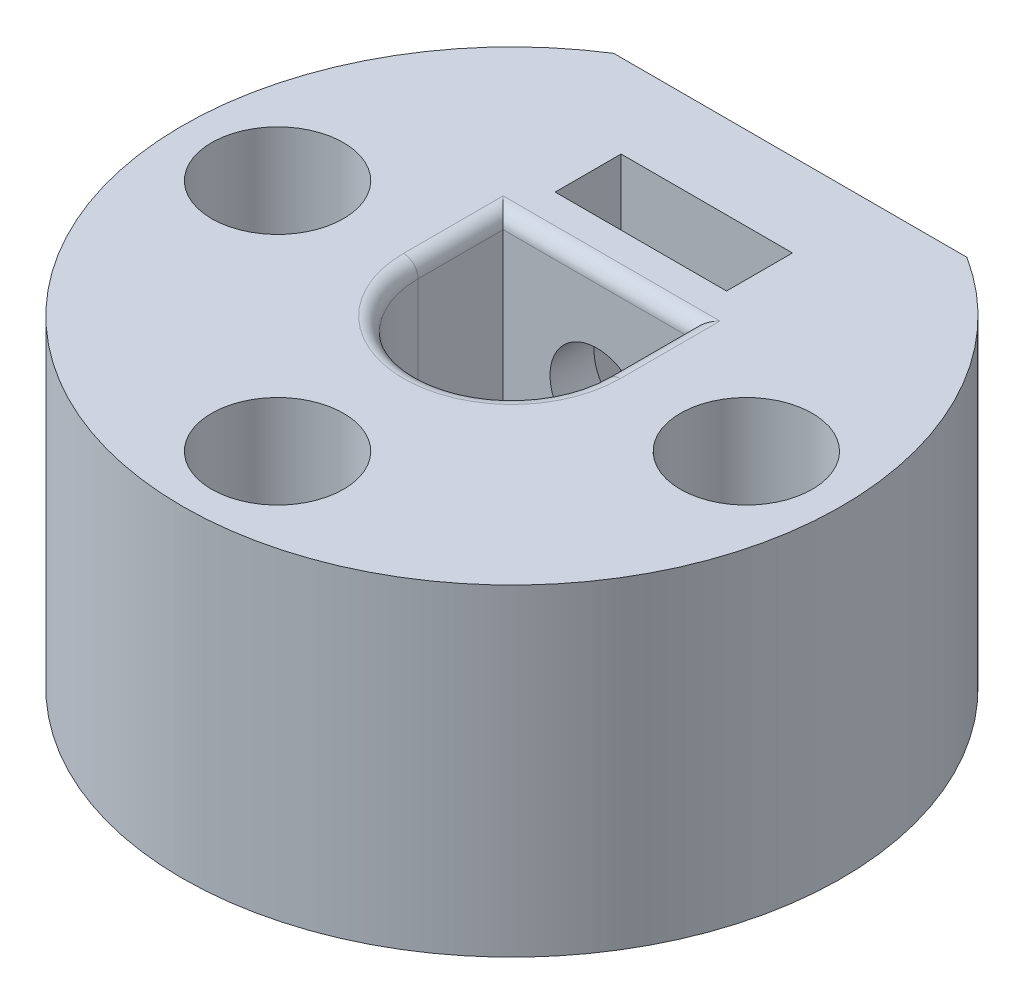
ISO-10303-21;
HEADER;
FILE_DESCRIPTION(('STEP AP214'),'2;1');
FILE_NAME('part.step','',(''),(''),'','','');
FILE_SCHEMA(('AUTOMOTIVE_DESIGN { 1 0 10303 214 1 1 1 1 }'));
ENDSEC;
DATA;
#1=APPLICATION_CONTEXT('core data for automotive mechanical design processes');
#2=APPLICATION_PROTOCOL_DEFINITION('international standard','automotive_design',2000,#1);
#3=PRODUCT_CONTEXT('',#1,'mechanical');
#4=PRODUCT('Part','Part','',(#3));
#5=PRODUCT_RELATED_PRODUCT_CATEGORY('part','',(#4));
#6=PRODUCT_DEFINITION_FORMATION('','',#4);
#7=PRODUCT_DEFINITION_CONTEXT('part definition',#1,'design');
#8=PRODUCT_DEFINITION('design','',#6,#7);
#9=PRODUCT_DEFINITION_SHAPE('','',#8);
#10=(LENGTH_UNIT() NAMED_UNIT(*) SI_UNIT(.MILLI.,.METRE.));
#11=(NAMED_UNIT(*) PLANE_ANGLE_UNIT() SI_UNIT($,.RADIAN.));
#12=(NAMED_UNIT(*) SI_UNIT($,.STERADIAN.) SOLID_ANGLE_UNIT());
#13=UNCERTAINTY_MEASURE_WITH_UNIT(LENGTH_MEASURE(1.E-05),#10,'distance_accuracy_value','');
#14=(GEOMETRIC_REPRESENTATION_CONTEXT(3) GLOBAL_UNCERTAINTY_ASSIGNED_CONTEXT((#13)) GLOBAL_UNIT_ASSIGNED_CONTEXT((#10,
#11,#12)) REPRESENTATION_CONTEXT('',''));
#15=CARTESIAN_POINT('',(0.,0.,0.));
#16=DIRECTION('',(0.,0.,1.));
#17=DIRECTION('',(1.,0.,0.));
#18=AXIS2_PLACEMENT_3D('',#15,#16,#17);
#19=CARTESIAN_POINT('',(0.,8.00000000000001,0.));
#20=DIRECTION('',(0.,1.,0.));
#21=DIRECTION('',(0.,0.,1.));
#22=AXIS2_PLACEMENT_3D('',#19,#20,#21);
#23=PLANE('',#22);
#24=CARTESIAN_POINT('',(-7.99999999999948,7.99999999999965,1.66533453693773E-13));
#25=DIRECTION('',(0.,1.,0.));
#26=DIRECTION('',(0.,0.,1.));
#27=AXIS2_PLACEMENT_3D('',#24,#25,#26);
#28=CIRCLE('',#27,2.25);
#29=CARTESIAN_POINT('',(-7.99999999999949,7.99999999999965,2.25000000000016));
#30=VERTEX_POINT('',#29);
#31=EDGE_CURVE('E460',#30,#30,#28,.T.);
#32=ORIENTED_EDGE('',*,*,#31,.F.);
#33=EDGE_LOOP('',(#32));
#34=FACE_BOUND('',#33,.T.);
#35=CARTESIAN_POINT('',(0.,8.00000000000001,7.99999999999998));
#36=DIRECTION('',(0.,1.,0.));
#37=DIRECTION('',(0.,0.,1.));
#38=AXIS2_PLACEMENT_3D('',#35,#36,#37);
#39=CIRCLE('',#38,2.25);
#40=CARTESIAN_POINT('',(0.,8.00000000000001,10.25));
#41=VERTEX_POINT('',#40);
#42=EDGE_CURVE('E477',#41,#41,#39,.T.);
#43=ORIENTED_EDGE('',*,*,#42,.F.);
#44=EDGE_LOOP('',(#43));
#45=FACE_BOUND('',#44,.T.);
#46=CARTESIAN_POINT('',(8.00000000000008,7.99999999999999,0.));
#47=DIRECTION('',(0.,1.,0.));
#48=DIRECTION('',(0.,0.,1.));
#49=AXIS2_PLACEMENT_3D('',#46,#47,#48);
#50=CIRCLE('',#49,2.25);
#51=CARTESIAN_POINT('',(8.00000000000006,7.99999999999999,2.24999999999994));
#52=VERTEX_POINT('',#51);
#53=EDGE_CURVE('E489',#52,#52,#50,.T.);
#54=ORIENTED_EDGE('',*,*,#53,.F.);
#55=EDGE_LOOP('',(#54));
#56=FACE_BOUND('',#55,.T.);
#57=DIRECTION('',(0.,0.,1.));
#58=VECTOR('',#57,1.);
#59=CARTESIAN_POINT('',(-3.69999999999952,7.99999999999965,0.));
#60=LINE('',#59,#58);
#61=CARTESIAN_POINT('',(-3.69999999999952,7.99999999999965,0.));
#62=VERTEX_POINT('',#61);
#63=CARTESIAN_POINT('',(-3.69999999999956,7.99999999999965,-3.39999999999993));
#64=VERTEX_POINT('',#63);
#65=EDGE_CURVE('E214',#62,#64,#60,.F.);
#66=ORIENTED_EDGE('',*,*,#65,.T.);
#67=DIRECTION('',(-0.999999999999986,0.,0.));
#68=VECTOR('',#67,1.);
#69=CARTESIAN_POINT('',(4.85722573273506E-13,7.99999999999965,-3.39999999999976));
#70=LINE('',#69,#68);
#71=CARTESIAN_POINT('',(3.70000000000005,8.00000000000001,-3.40000000000004));
#72=VERTEX_POINT('',#71);
#73=EDGE_CURVE('E217',#64,#72,#70,.F.);
#74=ORIENTED_EDGE('',*,*,#73,.T.);
#75=DIRECTION('',(0.,0.,-1.));
#76=VECTOR('',#75,1.);
#77=CARTESIAN_POINT('',(3.70000000000005,8.00000000000001,0.));
#78=LINE('',#77,#76);
#79=CARTESIAN_POINT('',(3.70000000000005,8.00000000000001,0.));
#80=VERTEX_POINT('',#79);
#81=EDGE_CURVE('E212',#72,#80,#78,.F.);
#82=ORIENTED_EDGE('',*,*,#81,.T.);
#83=CARTESIAN_POINT('',(0.,8.00000000000001,0.));
#84=DIRECTION('',(0.,1.,0.));
#85=DIRECTION('',(0.,0.,1.));
#86=AXIS2_PLACEMENT_3D('',#83,#84,#85);
#87=CIRCLE('',#86,3.7);
#88=EDGE_CURVE('E210',#80,#62,#87,.F.);
#89=ORIENTED_EDGE('',*,*,#88,.T.);
#90=EDGE_LOOP('',(#66,#74,#82,#89));
#91=FACE_BOUND('',#90,.T.);
#92=CARTESIAN_POINT('',(0.,8.00000000000001,0.));
#93=DIRECTION('',(0.,1.,0.));
#94=DIRECTION('',(0.,0.,1.));
#95=AXIS2_PLACEMENT_3D('',#92,#93,#94);
#96=CIRCLE('',#95,11.25);
#97=CARTESIAN_POINT('',(-6.02598539659659,7.99999999999965,-9.49999999999973));
#98=VERTEX_POINT('',#97);
#99=CARTESIAN_POINT('',(6.02598539659709,7.99999999999999,-9.49999999999993));
#100=VERTEX_POINT('',#99);
#101=EDGE_CURVE('E131',#98,#100,#96,.T.);
#102=ORIENTED_EDGE('',*,*,#101,.T.);
#103=DIRECTION('',(-0.999999999999986,0.,0.));
#104=VECTOR('',#103,1.);
#105=CARTESIAN_POINT('',(6.02598539659709,7.99999999999999,-9.49999999999993));
#106=LINE('',#105,#104);
#107=EDGE_CURVE('E134',#100,#98,#106,.T.);
#108=ORIENTED_EDGE('',*,*,#107,.T.);
#109=EDGE_LOOP('',(#102,#108));
#110=FACE_BOUND('',#109,.T.);
#111=DIRECTION('',(-0.999999999999986,0.,0.));
#112=VECTOR('',#111,1.);
#113=CARTESIAN_POINT('',(-2.92499999999946,7.99999999999965,-6.64999999999982));
#114=LINE('',#113,#112);
#115=CARTESIAN_POINT('',(2.92500000000015,7.99999999999966,-6.64999999999996));
#116=VERTEX_POINT('',#115);
#117=CARTESIAN_POINT('',(-2.92499999999946,7.99999999999965,-6.64999999999982));
#118=VERTEX_POINT('',#117);
#119=EDGE_CURVE('E152',#116,#118,#114,.T.);
#120=ORIENTED_EDGE('',*,*,#119,.F.);
#121=DIRECTION('',(0.,0.,-1.));
#122=VECTOR('',#121,1.);
#123=CARTESIAN_POINT('',(2.92500000000001,8.00000000000001,-4.40000000000001));
#124=LINE('',#123,#122);
#125=CARTESIAN_POINT('',(2.92500000000001,8.00000000000001,-4.40000000000001));
#126=VERTEX_POINT('',#125);
#127=EDGE_CURVE('E150',#126,#116,#124,.T.);
#128=ORIENTED_EDGE('',*,*,#127,.F.);
#129=DIRECTION('',(0.999999999999986,0.,0.));
#130=VECTOR('',#129,1.);
#131=CARTESIAN_POINT('',(-2.92499999999946,7.99999999999965,-4.39999999999976));
#132=LINE('',#131,#130);
#133=CARTESIAN_POINT('',(-2.92499999999946,7.99999999999965,-4.39999999999976));
#134=VERTEX_POINT('',#133);
#135=EDGE_CURVE('E157',#134,#126,#132,.T.);
#136=ORIENTED_EDGE('',*,*,#135,.F.);
#137=DIRECTION('',(0.,0.,1.));
#138=VECTOR('',#137,1.);
#139=CARTESIAN_POINT('',(-2.92499999999946,7.99999999999965,-4.39999999999976));
#140=LINE('',#139,#138);
#141=EDGE_CURVE('E155',#118,#134,#140,.T.);
#142=ORIENTED_EDGE('',*,*,#141,.F.);
#143=EDGE_LOOP('',(#120,#128,#136,#142));
#144=FACE_BOUND('',#143,.T.);
#145=ADVANCED_FACE('F32',(#34,#45,#56,#91,#110,#144),#23,.T.);
#146=CARTESIAN_POINT('',(1.38777878078145E-13,3.99999999999964,-9.50000000000001));
#147=DIRECTION('',(0.,0.,1.));
#148=DIRECTION('',(0.999999999999986,0.,0.));
#149=AXIS2_PLACEMENT_3D('',#146,#147,#148);
#150=CYLINDRICAL_SURFACE('',#149,1.6);
#151=CARTESIAN_POINT('',(1.38777878078145E-13,3.99999999999964,-9.50000000000001));
#152=DIRECTION('',(0.,0.,1.));
#153=DIRECTION('',(0.999999999999986,0.,0.));
#154=AXIS2_PLACEMENT_3D('',#151,#152,#153);
#155=CIRCLE('',#154,1.6);
#156=CARTESIAN_POINT('',(1.60000000000012,3.99999999999965,-9.50000000000002));
#157=VERTEX_POINT('',#156);
#158=EDGE_CURVE('E178',#157,#157,#155,.T.);
#159=ORIENTED_EDGE('',*,*,#158,.F.);
#160=EDGE_LOOP('',(#159));
#161=FACE_BOUND('',#160,.T.);
#162=CARTESIAN_POINT('',(4.9960036108132E-13,3.99999999999964,-6.64999999999991));
#163=DIRECTION('',(0.,0.,1.));
#164=DIRECTION('',(0.999999999999986,0.,0.));
#165=AXIS2_PLACEMENT_3D('',#162,#163,#164);
#166=CIRCLE('',#165,1.6);
#167=CARTESIAN_POINT('',(1.60000000000048,3.99999999999965,-6.64999999999991));
#168=VERTEX_POINT('',#167);
#169=EDGE_CURVE('E36',#168,#168,#166,.F.);
#170=ORIENTED_EDGE('',*,*,#169,.F.);
#171=EDGE_LOOP('',(#170));
#172=FACE_BOUND('',#171,.T.);
#173=ADVANCED_FACE('F239',(#161,#172),#150,.F.);
#174=CARTESIAN_POINT('',(1.66533453693773E-13,3.99999999999964,-2.90000000000007));
#175=DIRECTION('',(0.,0.,1.));
#176=DIRECTION('',(0.999999999999986,0.,0.));
#177=AXIS2_PLACEMENT_3D('',#174,#175,#176);
#178=CIRCLE('',#177,1.6);
#179=CARTESIAN_POINT('',(1.60000000000014,3.99999999999965,-2.90000000000008));
#180=VERTEX_POINT('',#179);
#181=EDGE_CURVE('E181',#180,#180,#178,.T.);
#182=ORIENTED_EDGE('',*,*,#181,.T.);
#183=EDGE_LOOP('',(#182));
#184=FACE_BOUND('',#183,.T.);
#185=CARTESIAN_POINT('',(1.80411241501588E-13,3.99999999999964,-4.39999999999985));
#186=DIRECTION('',(0.,0.,-1.));
#187=DIRECTION('',(-0.999999999999986,0.,0.));
#188=AXIS2_PLACEMENT_3D('',#185,#186,#187);
#189=CIRCLE('',#188,1.6);
#190=CARTESIAN_POINT('',(-1.5999999999998,3.99999999999964,-4.39999999999984));
#191=VERTEX_POINT('',#190);
#192=EDGE_CURVE('E177',#191,#191,#189,.F.);
#193=ORIENTED_EDGE('',*,*,#192,.F.);
#194=EDGE_LOOP('',(#193));
#195=FACE_BOUND('',#194,.T.);
#196=ADVANCED_FACE('F241',(#184,#195),#150,.F.);
#197=CARTESIAN_POINT('',(0.,8.00000000000001,0.));
#198=DIRECTION('',(0.,-1.,0.));
#199=DIRECTION('',(0.,0.,-1.));
#200=AXIS2_PLACEMENT_3D('',#197,#198,#199);
#201=CYLINDRICAL_SURFACE('',#200,11.25);
#202=DIRECTION('',(0.,-1.,0.));
#203=VECTOR('',#202,1.);
#204=CARTESIAN_POINT('',(-6.02598539659659,7.99999999999965,-9.49999999999973));
#205=LINE('',#204,#203);
#206=CARTESIAN_POINT('',(-6.02598539659695,-3.00000000000034,-9.49999999999998));
#207=VERTEX_POINT('',#206);
#208=EDGE_CURVE('E124',#98,#207,#205,.T.);
#209=ORIENTED_EDGE('',*,*,#208,.T.);
#210=CARTESIAN_POINT('',(0.,-3.,0.));
#211=DIRECTION('',(0.,-1.,0.));
#212=DIRECTION('',(0.,0.,-1.));
#213=AXIS2_PLACEMENT_3D('',#210,#211,#212);
#214=CIRCLE('',#213,11.25);
#215=CARTESIAN_POINT('',(6.02598539659709,-3.,-9.49999999999993));
#216=VERTEX_POINT('',#215);
#217=EDGE_CURVE('E129',#216,#207,#214,.T.);
#218=ORIENTED_EDGE('',*,*,#217,.F.);
#219=DIRECTION('',(0.,-1.,0.));
#220=VECTOR('',#219,1.);
#221=CARTESIAN_POINT('',(6.02598539659709,7.99999999999999,-9.49999999999993));
#222=LINE('',#221,#220);
#223=EDGE_CURVE('E133',#100,#216,#222,.T.);
#224=ORIENTED_EDGE('',*,*,#223,.F.);
#225=ORIENTED_EDGE('',*,*,#101,.F.);
#226=EDGE_LOOP('',(#209,#218,#224,#225));
#227=FACE_BOUND('',#226,.T.);
#228=ADVANCED_FACE('F126',(#227),#201,.T.);
#229=CARTESIAN_POINT('',(6.02598539659709,7.99999999999999,-9.49999999999993));
#230=DIRECTION('',(0.,0.,1.));
#231=DIRECTION('',(0.999999999999986,0.,0.));
#232=AXIS2_PLACEMENT_3D('',#229,#230,#231);
#233=PLANE('',#232);
#234=ORIENTED_EDGE('',*,*,#158,.T.);
#235=EDGE_LOOP('',(#234));
#236=FACE_BOUND('',#235,.T.);
#237=ORIENTED_EDGE('',*,*,#223,.T.);
#238=DIRECTION('',(0.999999999999986,0.,0.));
#239=VECTOR('',#238,1.);
#240=CARTESIAN_POINT('',(-6.02598539659695,-3.00000000000034,-9.49999999999998));
#241=LINE('',#240,#239);
#242=EDGE_CURVE('E137',#207,#216,#241,.T.);
#243=ORIENTED_EDGE('',*,*,#242,.F.);
#244=ORIENTED_EDGE('',*,*,#208,.F.);
#245=ORIENTED_EDGE('',*,*,#107,.F.);
#246=EDGE_LOOP('',(#237,#243,#244,#245));
#247=FACE_BOUND('',#246,.T.);
#248=ADVANCED_FACE('F138',(#236,#247),#233,.F.);
#249=CARTESIAN_POINT('',(0.,8.00000000000001,0.));
#250=DIRECTION('',(0.,-1.,0.));
#251=DIRECTION('',(0.,0.,-1.));
#252=AXIS2_PLACEMENT_3D('',#249,#250,#251);
#253=CYLINDRICAL_SURFACE('',#252,3.2);
#254=DIRECTION('',(0.,-1.,0.));
#255=VECTOR('',#254,1.);
#256=CARTESIAN_POINT('',(-3.19999999999979,7.99999999999965,0.));
#257=LINE('',#256,#255);
#258=CARTESIAN_POINT('',(-3.19999999999979,7.49999999999965,0.));
#259=VERTEX_POINT('',#258);
#260=CARTESIAN_POINT('',(-3.19999999999963,-3.60822483003176E-13,2.77555756156289E-13));
#261=VERTEX_POINT('',#260);
#262=EDGE_CURVE('E195',#259,#261,#257,.T.);
#263=ORIENTED_EDGE('',*,*,#262,.F.);
#264=CARTESIAN_POINT('',(0.,7.50000000000001,0.));
#265=DIRECTION('',(0.,1.,0.));
#266=DIRECTION('',(0.,0.,1.));
#267=AXIS2_PLACEMENT_3D('',#264,#265,#266);
#268=CIRCLE('',#267,3.2);
#269=CARTESIAN_POINT('',(3.20000000000027,7.49999999999999,0.));
#270=VERTEX_POINT('',#269);
#271=EDGE_CURVE('E11',#259,#270,#268,.T.);
#272=ORIENTED_EDGE('',*,*,#271,.T.);
#273=DIRECTION('',(0.,-1.,0.));
#274=VECTOR('',#273,1.);
#275=CARTESIAN_POINT('',(3.20000000000027,8.00000000000001,0.));
#276=LINE('',#275,#274);
#277=CARTESIAN_POINT('',(3.20000000000022,0.,0.));
#278=VERTEX_POINT('',#277);
#279=EDGE_CURVE('E202',#270,#278,#276,.T.);
#280=ORIENTED_EDGE('',*,*,#279,.T.);
#281=CARTESIAN_POINT('',(0.,0.,0.));
#282=DIRECTION('',(0.,1.,0.));
#283=DIRECTION('',(0.,0.,1.));
#284=AXIS2_PLACEMENT_3D('',#281,#282,#283);
#285=CIRCLE('',#284,3.2);
#286=EDGE_CURVE('E182',#261,#278,#285,.T.);
#287=ORIENTED_EDGE('',*,*,#286,.F.);
#288=EDGE_LOOP('',(#263,#272,#280,#287));
#289=FACE_BOUND('',#288,.T.);
#290=ADVANCED_FACE('F267',(#289),#253,.F.);
#291=CARTESIAN_POINT('',(3.20000000000027,8.00000000000001,0.));
#292=DIRECTION('',(-0.999999999999986,0.,0.));
#293=DIRECTION('',(0.,0.,1.));
#294=AXIS2_PLACEMENT_3D('',#291,#292,#293);
#295=PLANE('',#294);
#296=ORIENTED_EDGE('',*,*,#279,.F.);
#297=DIRECTION('',(0.,0.,-1.));
#298=VECTOR('',#297,1.);
#299=CARTESIAN_POINT('',(3.20000000000027,7.49999999999999,0.));
#300=LINE('',#299,#298);
#301=CARTESIAN_POINT('',(3.20000000000004,7.49999999999999,-2.89999999999996));
#302=VERTEX_POINT('',#301);
#303=EDGE_CURVE('E57',#270,#302,#300,.T.);
#304=ORIENTED_EDGE('',*,*,#303,.T.);
#305=DIRECTION('',(0.,-1.,0.));
#306=VECTOR('',#305,1.);
#307=CARTESIAN_POINT('',(3.20000000000004,8.00000000000001,-2.89999999999996));
#308=LINE('',#307,#306);
#309=CARTESIAN_POINT('',(3.20000000000004,0.,-2.89999999999996));
#310=VERTEX_POINT('',#309);
#311=EDGE_CURVE('E200',#302,#310,#308,.T.);
#312=ORIENTED_EDGE('',*,*,#311,.T.);
#313=DIRECTION('',(0.,0.,-1.));
#314=VECTOR('',#313,1.);
#315=CARTESIAN_POINT('',(3.20000000000022,0.,0.));
#316=LINE('',#315,#314);
#317=EDGE_CURVE('E185',#278,#310,#316,.T.);
#318=ORIENTED_EDGE('',*,*,#317,.F.);
#319=EDGE_LOOP('',(#296,#304,#312,#318));
#320=FACE_BOUND('',#319,.T.);
#321=ADVANCED_FACE('F263',(#320),#295,.T.);
#322=CARTESIAN_POINT('',(3.20000000000004,8.00000000000001,-2.89999999999996));
#323=DIRECTION('',(0.,0.,1.));
#324=DIRECTION('',(0.999999999999986,0.,0.));
#325=AXIS2_PLACEMENT_3D('',#322,#323,#324);
#326=PLANE('',#325);
#327=ORIENTED_EDGE('',*,*,#181,.F.);
#328=EDGE_LOOP('',(#327));
#329=FACE_BOUND('',#328,.T.);
#330=ORIENTED_EDGE('',*,*,#311,.F.);
#331=DIRECTION('',(-0.999999999999986,0.,0.));
#332=VECTOR('',#331,1.);
#333=CARTESIAN_POINT('',(3.20000000000004,7.49999999999999,-2.89999999999996));
#334=LINE('',#333,#332);
#335=CARTESIAN_POINT('',(-3.19999999999947,7.49999999999965,-2.89999999999996));
#336=VERTEX_POINT('',#335);
#337=EDGE_CURVE('E41',#302,#336,#334,.T.);
#338=ORIENTED_EDGE('',*,*,#337,.T.);
#339=DIRECTION('',(0.,-1.,0.));
#340=VECTOR('',#339,1.);
#341=CARTESIAN_POINT('',(-3.19999999999947,7.99999999999965,-2.89999999999996));
#342=LINE('',#341,#340);
#343=CARTESIAN_POINT('',(-3.19999999999995,-3.60822483003176E-13,-2.89999999999996));
#344=VERTEX_POINT('',#343);
#345=EDGE_CURVE('E198',#336,#344,#342,.T.);
#346=ORIENTED_EDGE('',*,*,#345,.T.);
#347=DIRECTION('',(-0.999999999999984,0.,0.));
#348=VECTOR('',#347,1.);
#349=CARTESIAN_POINT('',(3.20000000000004,0.,-2.89999999999996));
#350=LINE('',#349,#348);
#351=EDGE_CURVE('E189',#310,#344,#350,.T.);
#352=ORIENTED_EDGE('',*,*,#351,.F.);
#353=EDGE_LOOP('',(#330,#338,#346,#352));
#354=FACE_BOUND('',#353,.T.);
#355=ADVANCED_FACE('F259',(#329,#354),#326,.T.);
#356=CARTESIAN_POINT('',(-3.19999999999979,7.99999999999965,0.));
#357=DIRECTION('',(0.999999999999986,0.,0.));
#358=DIRECTION('',(0.,0.,-1.));
#359=AXIS2_PLACEMENT_3D('',#356,#357,#358);
#360=PLANE('',#359);
#361=ORIENTED_EDGE('',*,*,#345,.F.);
#362=DIRECTION('',(0.,0.,1.));
#363=VECTOR('',#362,1.);
#364=CARTESIAN_POINT('',(-3.19999999999979,7.49999999999965,0.));
#365=LINE('',#364,#363);
#366=EDGE_CURVE('E207',#336,#259,#365,.T.);
#367=ORIENTED_EDGE('',*,*,#366,.T.);
#368=ORIENTED_EDGE('',*,*,#262,.T.);
#369=DIRECTION('',(0.,0.,1.));
#370=VECTOR('',#369,1.);
#371=CARTESIAN_POINT('',(-3.19999999999963,-3.60822483003176E-13,2.77555756156289E-13));
#372=LINE('',#371,#370);
#373=EDGE_CURVE('E192',#344,#261,#372,.T.);
#374=ORIENTED_EDGE('',*,*,#373,.F.);
#375=EDGE_LOOP('',(#361,#367,#368,#374));
#376=FACE_BOUND('',#375,.T.);
#377=ADVANCED_FACE('F256',(#376),#360,.T.);
#378=CARTESIAN_POINT('',(3.70000000000005,7.49999999999999,0.));
#379=DIRECTION('',(0.,0.,-1.));
#380=DIRECTION('',(-0.999999999999986,0.,0.));
#381=AXIS2_PLACEMENT_3D('',#378,#379,#380);
#382=CYLINDRICAL_SURFACE('',#381,0.5);
#383=CARTESIAN_POINT('',(3.70000000000005,7.49999999999999,0.));
#384=DIRECTION('',(0.,0.,1.));
#385=DIRECTION('',(0.999999999999986,0.,0.));
#386=AXIS2_PLACEMENT_3D('',#383,#384,#385);
#387=CIRCLE('',#386,0.5);
#388=EDGE_CURVE('E225',#80,#270,#387,.T.);
#389=ORIENTED_EDGE('',*,*,#388,.F.);
#390=ORIENTED_EDGE('',*,*,#81,.F.);
#391=CARTESIAN_POINT('',(3.70000000000005,7.49999999999999,-3.40000000000004));
#392=DIRECTION('',(-0.707106781186533,0.,-0.707106781186545));
#393=DIRECTION('',(0.70710678118654,0.,-0.707106781186552));
#394=AXIS2_PLACEMENT_3D('',#391,#392,#393);
#395=ELLIPSE('',#394,0.707106781186547,0.5);
#396=EDGE_CURVE('E186',#302,#72,#395,.T.);
#397=ORIENTED_EDGE('',*,*,#396,.F.);
#398=ORIENTED_EDGE('',*,*,#303,.F.);
#399=EDGE_LOOP('',(#389,#390,#397,#398));
#400=FACE_BOUND('',#399,.T.);
#401=ADVANCED_FACE('F34',(#400),#382,.T.);
#402=CARTESIAN_POINT('',(3.20000000000033,7.49999999999999,-3.39999999999988));
#403=DIRECTION('',(-0.999999999999986,0.,0.));
#404=DIRECTION('',(0.,0.,1.));
#405=AXIS2_PLACEMENT_3D('',#402,#403,#404);
#406=CYLINDRICAL_SURFACE('',#405,0.5);
#407=ORIENTED_EDGE('',*,*,#396,.T.);
#408=ORIENTED_EDGE('',*,*,#73,.F.);
#409=CARTESIAN_POINT('',(-3.69999999999956,7.49999999999965,-3.39999999999993));
#410=DIRECTION('',(-0.70710678118654,0.,0.707106781186552));
#411=DIRECTION('',(0.707106781186533,0.,0.707106781186545));
#412=AXIS2_PLACEMENT_3D('',#409,#410,#411);
#413=ELLIPSE('',#412,0.707106781186547,0.5);
#414=EDGE_CURVE('E223',#336,#64,#413,.T.);
#415=ORIENTED_EDGE('',*,*,#414,.F.);
#416=ORIENTED_EDGE('',*,*,#337,.F.);
#417=EDGE_LOOP('',(#407,#408,#415,#416));
#418=FACE_BOUND('',#417,.T.);
#419=ADVANCED_FACE('F282',(#418),#406,.T.);
#420=CARTESIAN_POINT('',(0.,7.50000000000001,0.));
#421=DIRECTION('',(0.,1.,0.));
#422=DIRECTION('',(0.,0.,1.));
#423=AXIS2_PLACEMENT_3D('',#420,#421,#422);
#424=TOROIDAL_SURFACE('',#423,3.7,0.5);
#425=ORIENTED_EDGE('',*,*,#388,.T.);
#426=ORIENTED_EDGE('',*,*,#271,.F.);
#427=CARTESIAN_POINT('',(-3.69999999999952,7.49999999999965,0.));
#428=DIRECTION('',(0.,0.,-1.));
#429=DIRECTION('',(-0.999999999999986,0.,0.));
#430=AXIS2_PLACEMENT_3D('',#427,#428,#429);
#431=CIRCLE('',#430,0.5);
#432=EDGE_CURVE('E221',#62,#259,#431,.T.);
#433=ORIENTED_EDGE('',*,*,#432,.F.);
#434=ORIENTED_EDGE('',*,*,#88,.F.);
#435=EDGE_LOOP('',(#425,#426,#433,#434));
#436=FACE_BOUND('',#435,.T.);
#437=ADVANCED_FACE('F279',(#436),#424,.T.);
#438=CARTESIAN_POINT('',(-3.69999999999952,7.49999999999965,0.));
#439=DIRECTION('',(0.,0.,1.));
#440=DIRECTION('',(0.999999999999986,0.,0.));
#441=AXIS2_PLACEMENT_3D('',#438,#439,#440);
#442=CYLINDRICAL_SURFACE('',#441,0.5);
#443=ORIENTED_EDGE('',*,*,#414,.T.);
#444=ORIENTED_EDGE('',*,*,#65,.F.);
#445=ORIENTED_EDGE('',*,*,#432,.T.);
#446=ORIENTED_EDGE('',*,*,#366,.F.);
#447=EDGE_LOOP('',(#443,#444,#445,#446));
#448=FACE_BOUND('',#447,.T.);
#449=ADVANCED_FACE('F276',(#448),#442,.T.);
#450=CARTESIAN_POINT('',(-2.92499999999946,7.99999999999965,-6.64999999999982));
#451=DIRECTION('',(0.,0.,1.));
#452=DIRECTION('',(0.999999999999986,0.,0.));
#453=AXIS2_PLACEMENT_3D('',#450,#451,#452);
#454=PLANE('',#453);
#455=DIRECTION('',(-0.999999999999986,0.,0.));
#456=VECTOR('',#455,1.);
#457=CARTESIAN_POINT('',(-2.92500000000001,-3.33066907387547E-13,-6.64999999999996));
#458=LINE('',#457,#456);
#459=CARTESIAN_POINT('',(2.92500000000005,-3.60822483003176E-13,-6.64999999999999));
#460=VERTEX_POINT('',#459);
#461=CARTESIAN_POINT('',(-2.92500000000001,-3.33066907387547E-13,-6.64999999999996));
#462=VERTEX_POINT('',#461);
#463=EDGE_CURVE('E162',#460,#462,#458,.T.);
#464=ORIENTED_EDGE('',*,*,#463,.F.);
#465=DIRECTION('',(0.,-1.,0.));
#466=VECTOR('',#465,1.);
#467=CARTESIAN_POINT('',(2.92500000000015,7.99999999999966,-6.64999999999996));
#468=LINE('',#467,#466);
#469=EDGE_CURVE('E174',#116,#460,#468,.T.);
#470=ORIENTED_EDGE('',*,*,#469,.F.);
#471=ORIENTED_EDGE('',*,*,#119,.T.);
#472=DIRECTION('',(0.,-1.,0.));
#473=VECTOR('',#472,1.);
#474=CARTESIAN_POINT('',(-2.92499999999946,7.99999999999965,-6.64999999999982));
#475=LINE('',#474,#473);
#476=EDGE_CURVE('E172',#118,#462,#475,.T.);
#477=ORIENTED_EDGE('',*,*,#476,.T.);
#478=EDGE_LOOP('',(#464,#470,#471,#477));
#479=FACE_BOUND('',#478,.T.);
#480=ORIENTED_EDGE('',*,*,#169,.T.);
#481=EDGE_LOOP('',(#480));
#482=FACE_BOUND('',#481,.T.);
#483=ADVANCED_FACE('F237',(#479,#482),#454,.T.);
#484=CARTESIAN_POINT('',(-2.92499999999946,7.99999999999965,-4.39999999999976));
#485=DIRECTION('',(0.,0.,-1.));
#486=DIRECTION('',(-0.999999999999986,0.,0.));
#487=AXIS2_PLACEMENT_3D('',#484,#485,#486);
#488=PLANE('',#487);
#489=DIRECTION('',(0.999999999999986,0.,0.));
#490=VECTOR('',#489,1.);
#491=CARTESIAN_POINT('',(-2.92499999999955,-3.60822483003176E-13,-4.39999999999982));
#492=LINE('',#491,#490);
#493=CARTESIAN_POINT('',(-2.92499999999955,-3.60822483003176E-13,-4.39999999999982));
#494=VERTEX_POINT('',#493);
#495=CARTESIAN_POINT('',(2.92500000000001,0.,-4.40000000000001));
#496=VERTEX_POINT('',#495);
#497=EDGE_CURVE('E153',#494,#496,#492,.T.);
#498=ORIENTED_EDGE('',*,*,#497,.F.);
#499=DIRECTION('',(0.,-1.,0.));
#500=VECTOR('',#499,1.);
#501=CARTESIAN_POINT('',(-2.92499999999946,7.99999999999965,-4.39999999999976));
#502=LINE('',#501,#500);
#503=EDGE_CURVE('E49',#134,#494,#502,.T.);
#504=ORIENTED_EDGE('',*,*,#503,.F.);
#505=ORIENTED_EDGE('',*,*,#135,.T.);
#506=DIRECTION('',(0.,-1.,0.));
#507=VECTOR('',#506,1.);
#508=CARTESIAN_POINT('',(2.92500000000001,8.00000000000001,-4.40000000000001));
#509=LINE('',#508,#507);
#510=EDGE_CURVE('E159',#126,#496,#509,.T.);
#511=ORIENTED_EDGE('',*,*,#510,.T.);
#512=EDGE_LOOP('',(#498,#504,#505,#511));
#513=FACE_BOUND('',#512,.T.);
#514=ORIENTED_EDGE('',*,*,#192,.T.);
#515=EDGE_LOOP('',(#514));
#516=FACE_BOUND('',#515,.T.);
#517=ADVANCED_FACE('F325',(#513,#516),#488,.T.);
#518=CARTESIAN_POINT('',(2.92500000000001,8.00000000000001,-4.40000000000001));
#519=DIRECTION('',(-0.999999999999986,0.,0.));
#520=DIRECTION('',(0.,0.,1.));
#521=AXIS2_PLACEMENT_3D('',#518,#519,#520);
#522=PLANE('',#521);
#523=DIRECTION('',(0.,0.,-1.));
#524=VECTOR('',#523,1.);
#525=CARTESIAN_POINT('',(2.92500000000001,0.,-4.40000000000001));
#526=LINE('',#525,#524);
#527=EDGE_CURVE('E140',#496,#460,#526,.T.);
#528=ORIENTED_EDGE('',*,*,#527,.F.);
#529=ORIENTED_EDGE('',*,*,#510,.F.);
#530=ORIENTED_EDGE('',*,*,#127,.T.);
#531=ORIENTED_EDGE('',*,*,#469,.T.);
#532=EDGE_LOOP('',(#528,#529,#530,#531));
#533=FACE_BOUND('',#532,.T.);
#534=ADVANCED_FACE('F254',(#533),#522,.T.);
#535=CARTESIAN_POINT('',(-2.92499999999946,7.99999999999965,-4.39999999999976));
#536=DIRECTION('',(0.999999999999986,0.,0.));
#537=DIRECTION('',(0.,0.,-1.));
#538=AXIS2_PLACEMENT_3D('',#535,#536,#537);
#539=PLANE('',#538);
#540=DIRECTION('',(0.,0.,1.));
#541=VECTOR('',#540,1.);
#542=CARTESIAN_POINT('',(-2.92499999999955,-3.60822483003176E-13,-4.39999999999982));
#543=LINE('',#542,#541);
#544=EDGE_CURVE('E165',#462,#494,#543,.T.);
#545=ORIENTED_EDGE('',*,*,#544,.F.);
#546=ORIENTED_EDGE('',*,*,#476,.F.);
#547=ORIENTED_EDGE('',*,*,#141,.T.);
#548=ORIENTED_EDGE('',*,*,#503,.T.);
#549=EDGE_LOOP('',(#545,#546,#547,#548));
#550=FACE_BOUND('',#549,.T.);
#551=ADVANCED_FACE('F321',(#550),#539,.T.);
#552=CARTESIAN_POINT('',(0.,0.,0.));
#553=DIRECTION('',(0.,-1.,0.));
#554=DIRECTION('',(0.,0.,-1.));
#555=AXIS2_PLACEMENT_3D('',#552,#553,#554);
#556=PLANE('',#555);
#557=ORIENTED_EDGE('',*,*,#497,.T.);
#558=ORIENTED_EDGE('',*,*,#527,.T.);
#559=ORIENTED_EDGE('',*,*,#463,.T.);
#560=ORIENTED_EDGE('',*,*,#544,.T.);
#561=EDGE_LOOP('',(#557,#558,#559,#560));
#562=FACE_BOUND('',#561,.T.);
#563=ADVANCED_FACE('F312',(#562),#556,.F.);
#564=ORIENTED_EDGE('',*,*,#373,.T.);
#565=ORIENTED_EDGE('',*,*,#286,.T.);
#566=ORIENTED_EDGE('',*,*,#317,.T.);
#567=ORIENTED_EDGE('',*,*,#351,.T.);
#568=EDGE_LOOP('',(#564,#565,#566,#567));
#569=FACE_BOUND('',#568,.T.);
#570=ADVANCED_FACE('F308',(#569),#556,.F.);
#571=CARTESIAN_POINT('',(0.,-3.,0.));
#572=DIRECTION('',(0.,-1.,0.));
#573=DIRECTION('',(0.,0.,-1.));
#574=AXIS2_PLACEMENT_3D('',#571,#572,#573);
#575=PLANE('',#574);
#576=CARTESIAN_POINT('',(0.,-3.,0.));
#577=DIRECTION('',(0.,-1.,0.));
#578=DIRECTION('',(0.,0.,-1.));
#579=AXIS2_PLACEMENT_3D('',#576,#577,#578);
#580=CIRCLE('',#579,4.25);
#581=CARTESIAN_POINT('',(0.,-3.00000000000001,-4.25));
#582=VERTEX_POINT('',#581);
#583=EDGE_CURVE('E461',#582,#582,#580,.T.);
#584=ORIENTED_EDGE('',*,*,#583,.F.);
#585=EDGE_LOOP('',(#584));
#586=FACE_BOUND('',#585,.T.);
#587=CARTESIAN_POINT('',(-7.99999999999992,-3.00000000000036,0.));
#588=DIRECTION('',(0.,1.,0.));
#589=DIRECTION('',(0.,0.,1.));
#590=AXIS2_PLACEMENT_3D('',#587,#588,#589);
#591=CIRCLE('',#590,1.25);
#592=CARTESIAN_POINT('',(-7.99999999999993,-3.00000000000036,1.25000000000003));
#593=VERTEX_POINT('',#592);
#594=EDGE_CURVE('E474',#593,#593,#591,.T.);
#595=ORIENTED_EDGE('',*,*,#594,.T.);
#596=EDGE_LOOP('',(#595));
#597=FACE_BOUND('',#596,.T.);
#598=CARTESIAN_POINT('',(0.,-3.,8.00000000000004));
#599=DIRECTION('',(0.,1.,0.));
#600=DIRECTION('',(0.,0.,1.));
#601=AXIS2_PLACEMENT_3D('',#598,#599,#600);
#602=CIRCLE('',#601,1.25);
#603=CARTESIAN_POINT('',(0.,-3.,9.25000000000004));
#604=VERTEX_POINT('',#603);
#605=EDGE_CURVE('E486',#604,#604,#602,.T.);
#606=ORIENTED_EDGE('',*,*,#605,.T.);
#607=EDGE_LOOP('',(#606));
#608=FACE_BOUND('',#607,.T.);
#609=CARTESIAN_POINT('',(8.00000000000019,-3.,0.));
#610=DIRECTION('',(0.,1.,0.));
#611=DIRECTION('',(0.,0.,1.));
#612=AXIS2_PLACEMENT_3D('',#609,#610,#611);
#613=CIRCLE('',#612,1.25);
#614=CARTESIAN_POINT('',(8.00000000000018,-3.,1.25000000000006));
#615=VERTEX_POINT('',#614);
#616=EDGE_CURVE('E143',#615,#615,#613,.T.);
#617=ORIENTED_EDGE('',*,*,#616,.T.);
#618=EDGE_LOOP('',(#617));
#619=FACE_BOUND('',#618,.T.);
#620=ORIENTED_EDGE('',*,*,#217,.T.);
#621=ORIENTED_EDGE('',*,*,#242,.T.);
#622=EDGE_LOOP('',(#620,#621));
#623=FACE_BOUND('',#622,.T.);
#624=ADVANCED_FACE('F142',(#586,#597,#608,#619,#623),#575,.T.);
#625=CARTESIAN_POINT('',(8.00000000000008,7.99999999999999,0.));
#626=DIRECTION('',(0.,1.,0.));
#627=DIRECTION('',(0.,0.,1.));
#628=AXIS2_PLACEMENT_3D('',#625,#626,#627);
#629=CYLINDRICAL_SURFACE('',#628,1.25);
#630=ORIENTED_EDGE('',*,*,#616,.F.);
#631=EDGE_LOOP('',(#630));
#632=FACE_BOUND('',#631,.T.);
#633=CARTESIAN_POINT('',(8.00000000000008,2.69999999999999,0.));
#634=DIRECTION('',(0.,1.,0.));
#635=DIRECTION('',(0.,0.,1.));
#636=AXIS2_PLACEMENT_3D('',#633,#634,#635);
#637=CIRCLE('',#636,1.25);
#638=CARTESIAN_POINT('',(8.00000000000007,2.69999999999999,1.24999999999994));
#639=VERTEX_POINT('',#638);
#640=EDGE_CURVE('E146',#639,#639,#637,.T.);
#641=ORIENTED_EDGE('',*,*,#640,.T.);
#642=EDGE_LOOP('',(#641));
#643=FACE_BOUND('',#642,.T.);
#644=ADVANCED_FACE('F318',(#632,#643),#629,.F.);
#645=CARTESIAN_POINT('',(9.25000000000004,2.69999999999999,0.));
#646=DIRECTION('',(0.,-1.,0.));
#647=DIRECTION('',(0.,0.,-1.));
#648=AXIS2_PLACEMENT_3D('',#645,#646,#647);
#649=PLANE('',#648);
#650=ORIENTED_EDGE('',*,*,#640,.F.);
#651=EDGE_LOOP('',(#650));
#652=FACE_BOUND('',#651,.T.);
#653=CARTESIAN_POINT('',(8.00000000000008,2.69999999999999,0.));
#654=DIRECTION('',(0.,1.,0.));
#655=DIRECTION('',(0.,0.,1.));
#656=AXIS2_PLACEMENT_3D('',#653,#654,#655);
#657=CIRCLE('',#656,2.25);
#658=CARTESIAN_POINT('',(8.00000000000006,2.7,2.24999999999995));
#659=VERTEX_POINT('',#658);
#660=EDGE_CURVE('E492',#659,#659,#657,.T.);
#661=ORIENTED_EDGE('',*,*,#660,.T.);
#662=EDGE_LOOP('',(#661));
#663=FACE_BOUND('',#662,.T.);
#664=ADVANCED_FACE('F376',(#652,#663),#649,.F.);
#665=CARTESIAN_POINT('',(8.00000000000008,7.99999999999999,0.));
#666=DIRECTION('',(0.,1.,0.));
#667=DIRECTION('',(0.,0.,1.));
#668=AXIS2_PLACEMENT_3D('',#665,#666,#667);
#669=CYLINDRICAL_SURFACE('',#668,2.25);
#670=ORIENTED_EDGE('',*,*,#660,.F.);
#671=EDGE_LOOP('',(#670));
#672=FACE_BOUND('',#671,.T.);
#673=ORIENTED_EDGE('',*,*,#53,.T.);
#674=EDGE_LOOP('',(#673));
#675=FACE_BOUND('',#674,.T.);
#676=ADVANCED_FACE('F383',(#672,#675),#669,.F.);
#677=CARTESIAN_POINT('',(0.,8.00000000000001,7.99999999999998));
#678=DIRECTION('',(0.,1.,0.));
#679=DIRECTION('',(0.,0.,1.));
#680=AXIS2_PLACEMENT_3D('',#677,#678,#679);
#681=CYLINDRICAL_SURFACE('',#680,1.25);
#682=ORIENTED_EDGE('',*,*,#605,.F.);
#683=EDGE_LOOP('',(#682));
#684=FACE_BOUND('',#683,.T.);
#685=CARTESIAN_POINT('',(0.,2.70000000000002,8.00000000000004));
#686=DIRECTION('',(0.,1.,0.));
#687=DIRECTION('',(0.,0.,1.));
#688=AXIS2_PLACEMENT_3D('',#685,#686,#687);
#689=CIRCLE('',#688,1.25);
#690=CARTESIAN_POINT('',(0.,2.70000000000002,9.25000000000004));
#691=VERTEX_POINT('',#690);
#692=EDGE_CURVE('E483',#691,#691,#689,.T.);
#693=ORIENTED_EDGE('',*,*,#692,.T.);
#694=EDGE_LOOP('',(#693));
#695=FACE_BOUND('',#694,.T.);
#696=ADVANCED_FACE('F391',(#684,#695),#681,.F.);
#697=CARTESIAN_POINT('',(1.25000000000004,2.70000000000002,8.00000000000004));
#698=DIRECTION('',(0.,-1.,0.));
#699=DIRECTION('',(0.,0.,-1.));
#700=AXIS2_PLACEMENT_3D('',#697,#698,#699);
#701=PLANE('',#700);
#702=ORIENTED_EDGE('',*,*,#692,.F.);
#703=EDGE_LOOP('',(#702));
#704=FACE_BOUND('',#703,.T.);
#705=CARTESIAN_POINT('',(0.,2.70000000000002,8.00000000000004));
#706=DIRECTION('',(0.,1.,0.));
#707=DIRECTION('',(0.,0.,1.));
#708=AXIS2_PLACEMENT_3D('',#705,#706,#707);
#709=CIRCLE('',#708,2.25);
#710=CARTESIAN_POINT('',(0.,2.70000000000002,10.25));
#711=VERTEX_POINT('',#710);
#712=EDGE_CURVE('E480',#711,#711,#709,.T.);
#713=ORIENTED_EDGE('',*,*,#712,.T.);
#714=EDGE_LOOP('',(#713));
#715=FACE_BOUND('',#714,.T.);
#716=ADVANCED_FACE('F399',(#704,#715),#701,.F.);
#717=CARTESIAN_POINT('',(0.,8.00000000000001,7.99999999999998));
#718=DIRECTION('',(0.,1.,0.));
#719=DIRECTION('',(0.,0.,1.));
#720=AXIS2_PLACEMENT_3D('',#717,#718,#719);
#721=CYLINDRICAL_SURFACE('',#720,2.25);
#722=ORIENTED_EDGE('',*,*,#712,.F.);
#723=EDGE_LOOP('',(#722));
#724=FACE_BOUND('',#723,.T.);
#725=ORIENTED_EDGE('',*,*,#42,.T.);
#726=EDGE_LOOP('',(#725));
#727=FACE_BOUND('',#726,.T.);
#728=ADVANCED_FACE('F407',(#724,#727),#721,.F.);
#729=CARTESIAN_POINT('',(-7.99999999999948,7.99999999999965,1.66533453693773E-13));
#730=DIRECTION('',(0.,1.,0.));
#731=DIRECTION('',(0.,0.,1.));
#732=AXIS2_PLACEMENT_3D('',#729,#730,#731);
#733=CYLINDRICAL_SURFACE('',#732,1.25);
#734=ORIENTED_EDGE('',*,*,#594,.F.);
#735=EDGE_LOOP('',(#734));
#736=FACE_BOUND('',#735,.T.);
#737=CARTESIAN_POINT('',(-7.99999999999955,2.69999999999965,1.38777878078145E-13));
#738=DIRECTION('',(0.,1.,0.));
#739=DIRECTION('',(0.,0.,1.));
#740=AXIS2_PLACEMENT_3D('',#737,#738,#739);
#741=CIRCLE('',#740,1.25);
#742=CARTESIAN_POINT('',(-7.99999999999956,2.69999999999965,1.25000000000014));
#743=VERTEX_POINT('',#742);
#744=EDGE_CURVE('E471',#743,#743,#741,.T.);
#745=ORIENTED_EDGE('',*,*,#744,.T.);
#746=EDGE_LOOP('',(#745));
#747=FACE_BOUND('',#746,.T.);
#748=ADVANCED_FACE('F415',(#736,#747),#733,.F.);
#749=CARTESIAN_POINT('',(-6.74999999999962,2.69999999999965,0.));
#750=DIRECTION('',(0.,-1.,0.));
#751=DIRECTION('',(0.,0.,-1.));
#752=AXIS2_PLACEMENT_3D('',#749,#750,#751);
#753=PLANE('',#752);
#754=ORIENTED_EDGE('',*,*,#744,.F.);
#755=EDGE_LOOP('',(#754));
#756=FACE_BOUND('',#755,.T.);
#757=CARTESIAN_POINT('',(-7.99999999999955,2.69999999999965,1.38777878078145E-13));
#758=DIRECTION('',(0.,1.,0.));
#759=DIRECTION('',(0.,0.,1.));
#760=AXIS2_PLACEMENT_3D('',#757,#758,#759);
#761=CIRCLE('',#760,2.25);
#762=CARTESIAN_POINT('',(-7.99999999999956,2.69999999999965,2.25000000000014));
#763=VERTEX_POINT('',#762);
#764=EDGE_CURVE('E464',#763,#763,#761,.T.);
#765=ORIENTED_EDGE('',*,*,#764,.T.);
#766=EDGE_LOOP('',(#765));
#767=FACE_BOUND('',#766,.T.);
#768=ADVANCED_FACE('F423',(#756,#767),#753,.F.);
#769=CARTESIAN_POINT('',(-7.99999999999948,7.99999999999965,1.66533453693773E-13));
#770=DIRECTION('',(0.,1.,0.));
#771=DIRECTION('',(0.,0.,1.));
#772=AXIS2_PLACEMENT_3D('',#769,#770,#771);
#773=CYLINDRICAL_SURFACE('',#772,2.25);
#774=ORIENTED_EDGE('',*,*,#764,.F.);
#775=EDGE_LOOP('',(#774));
#776=FACE_BOUND('',#775,.T.);
#777=ORIENTED_EDGE('',*,*,#31,.T.);
#778=EDGE_LOOP('',(#777));
#779=FACE_BOUND('',#778,.T.);
#780=ADVANCED_FACE('F431',(#776,#779),#773,.F.);
#781=CARTESIAN_POINT('',(0.,-1.,0.));
#782=DIRECTION('',(0.,-1.,0.));
#783=DIRECTION('',(0.,0.,-1.));
#784=AXIS2_PLACEMENT_3D('',#781,#782,#783);
#785=CYLINDRICAL_SURFACE('',#784,4.25);
#786=CARTESIAN_POINT('',(0.,-1.,0.));
#787=DIRECTION('',(0.,-1.,0.));
#788=DIRECTION('',(0.,0.,-1.));
#789=AXIS2_PLACEMENT_3D('',#786,#787,#788);
#790=CIRCLE('',#789,4.25);
#791=CARTESIAN_POINT('',(0.,-1.,-4.25));
#792=VERTEX_POINT('',#791);
#793=EDGE_CURVE('E459',#792,#792,#790,.T.);
#794=ORIENTED_EDGE('',*,*,#793,.F.);
#795=EDGE_LOOP('',(#794));
#796=FACE_BOUND('',#795,.T.);
#797=ORIENTED_EDGE('',*,*,#583,.T.);
#798=EDGE_LOOP('',(#797));
#799=FACE_BOUND('',#798,.T.);
#800=ADVANCED_FACE('F439',(#796,#799),#785,.F.);
#801=CARTESIAN_POINT('',(0.,-1.,0.));
#802=DIRECTION('',(0.,-1.,0.));
#803=DIRECTION('',(0.,0.,-1.));
#804=AXIS2_PLACEMENT_3D('',#801,#802,#803);
#805=PLANE('',#804);
#806=ORIENTED_EDGE('',*,*,#793,.T.);
#807=EDGE_LOOP('',(#806));
#808=FACE_BOUND('',#807,.T.);
#809=ADVANCED_FACE('F447',(#808),#805,.T.);
#810=CLOSED_SHELL('',(#145,#173,#196,#228,#248,#290,#321,#355,#377,#401,#419,#437,#449,#483,
#517,#534,#551,#563,#570,#624,#644,#664,#676,#696,#716,#728,#748,#768,#780,#800,#809));
#811=MANIFOLD_SOLID_BREP('B2',#810);
#812=ADVANCED_BREP_SHAPE_REPRESENTATION('',(#18,#811),#14);
#813=SHAPE_DEFINITION_REPRESENTATION(#9,#812);
ENDSEC;
END-ISO-10303-21;
